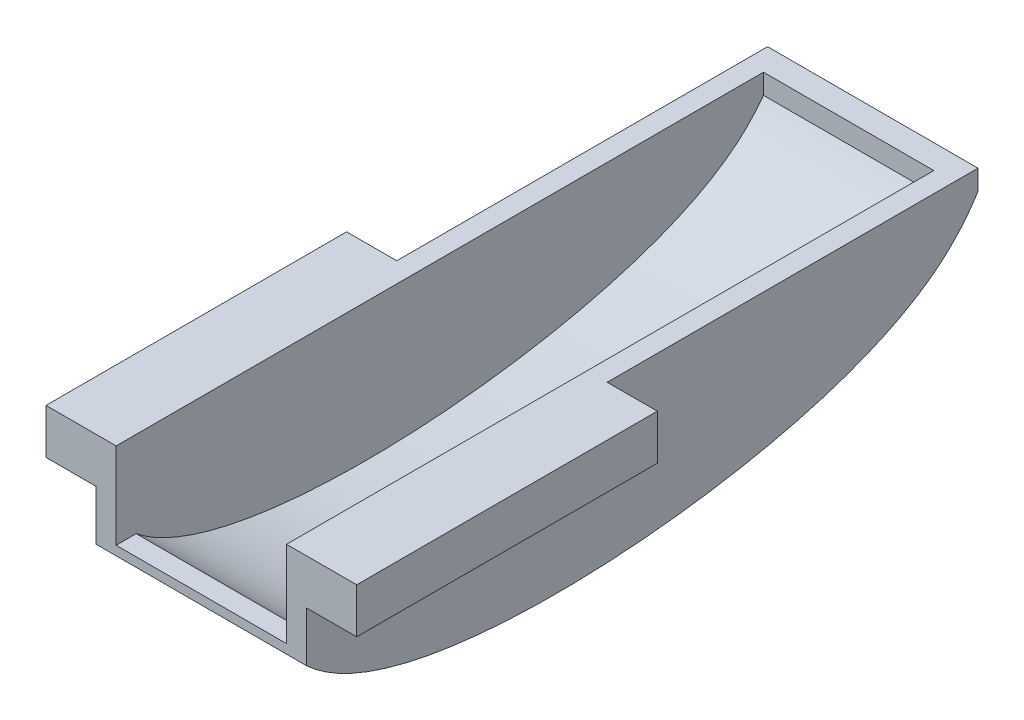
ISO-10303-21;
HEADER;
FILE_DESCRIPTION(('STEP AP214'),'2;1');
FILE_NAME('part.step','',(''),(''),'','','');
FILE_SCHEMA(('AUTOMOTIVE_DESIGN { 1 0 10303 214 1 1 1 1 }'));
ENDSEC;
DATA;
#1=APPLICATION_CONTEXT('core data for automotive mechanical design processes');
#2=APPLICATION_PROTOCOL_DEFINITION('international standard','automotive_design',2000,#1);
#3=PRODUCT_CONTEXT('',#1,'mechanical');
#4=PRODUCT('Part','Part','',(#3));
#5=PRODUCT_RELATED_PRODUCT_CATEGORY('part','',(#4));
#6=PRODUCT_DEFINITION_FORMATION('','',#4);
#7=PRODUCT_DEFINITION_CONTEXT('part definition',#1,'design');
#8=PRODUCT_DEFINITION('design','',#6,#7);
#9=PRODUCT_DEFINITION_SHAPE('','',#8);
#10=(LENGTH_UNIT() NAMED_UNIT(*) SI_UNIT(.MILLI.,.METRE.));
#11=(NAMED_UNIT(*) PLANE_ANGLE_UNIT() SI_UNIT($,.RADIAN.));
#12=(NAMED_UNIT(*) SI_UNIT($,.STERADIAN.) SOLID_ANGLE_UNIT());
#13=UNCERTAINTY_MEASURE_WITH_UNIT(LENGTH_MEASURE(1.E-05),#10,'distance_accuracy_value','');
#14=(GEOMETRIC_REPRESENTATION_CONTEXT(3) GLOBAL_UNCERTAINTY_ASSIGNED_CONTEXT((#13)) GLOBAL_UNIT_ASSIGNED_CONTEXT((#10,
#11,#12)) REPRESENTATION_CONTEXT('',''));
#15=CARTESIAN_POINT('',(0.,0.,0.));
#16=DIRECTION('',(0.,0.,1.));
#17=DIRECTION('',(1.,0.,0.));
#18=AXIS2_PLACEMENT_3D('',#15,#16,#17);
#19=CARTESIAN_POINT('',(10.5,-13.046875,30.375));
#20=DIRECTION('',(1.,0.,0.));
#21=DIRECTION('',(0.,0.,-1.));
#22=AXIS2_PLACEMENT_3D('',#19,#20,#21);
#23=PLANE('',#22);
#24=DIRECTION('',(0.,0.,1.));
#25=VECTOR('',#24,1.);
#26=CARTESIAN_POINT('',(10.5,2.00000000000028,2.40991752715528));
#27=LINE('',#26,#25);
#28=CARTESIAN_POINT('',(10.5,2.00000000000028,0.));
#29=VERTEX_POINT('',#28);
#30=CARTESIAN_POINT('',(10.5,2.00000000000028,37.));
#31=VERTEX_POINT('',#30);
#32=EDGE_CURVE('E163',#29,#31,#27,.T.);
#33=ORIENTED_EDGE('',*,*,#32,.T.);
#34=DIRECTION('',(0.,-1.,0.));
#35=VECTOR('',#34,1.);
#36=CARTESIAN_POINT('',(10.5,-2.49999999999972,37.));
#37=LINE('',#36,#35);
#38=CARTESIAN_POINT('',(10.5,-2.49999999999972,37.));
#39=VERTEX_POINT('',#38);
#40=EDGE_CURVE('E155',#31,#39,#37,.T.);
#41=ORIENTED_EDGE('',*,*,#40,.T.);
#42=DIRECTION('',(0.,0.,1.));
#43=VECTOR('',#42,1.);
#44=CARTESIAN_POINT('',(10.5,-2.49999999999972,37.));
#45=LINE('',#44,#43);
#46=CARTESIAN_POINT('',(10.5,-2.49999999999972,67.));
#47=VERTEX_POINT('',#46);
#48=EDGE_CURVE('E141',#39,#47,#45,.T.);
#49=ORIENTED_EDGE('',*,*,#48,.T.);
#50=DIRECTION('',(0.,-1.,0.));
#51=VECTOR('',#50,1.);
#52=CARTESIAN_POINT('',(10.5,-7.5,67.));
#53=LINE('',#52,#51);
#54=CARTESIAN_POINT('',(10.5,-7.5,67.));
#55=VERTEX_POINT('',#54);
#56=EDGE_CURVE('E247',#47,#55,#53,.T.);
#57=ORIENTED_EDGE('',*,*,#56,.T.);
#58=CARTESIAN_POINT('',(10.5,-7.5,67.));
#59=CARTESIAN_POINT('',(10.5,-14.,60.));
#60=CARTESIAN_POINT('',(10.5,-17.,44.));
#61=CARTESIAN_POINT('',(10.5,-13.,14.));
#62=CARTESIAN_POINT('',(10.5,-8.,5.));
#63=CARTESIAN_POINT('',(10.5,0.,0.));
#64=B_SPLINE_CURVE_WITH_KNOTS('',5,(#58,#59,#60,#61,#62,#63),.UNSPECIFIED.,.F.,.F.,(6,6),(0.,
1.),.UNSPECIFIED.);
#65=CARTESIAN_POINT('',(10.5,0.,0.));
#66=VERTEX_POINT('',#65);
#67=EDGE_CURVE('E236',#55,#66,#64,.T.);
#68=ORIENTED_EDGE('',*,*,#67,.T.);
#69=DIRECTION('',(0.,1.,0.));
#70=VECTOR('',#69,1.);
#71=CARTESIAN_POINT('',(10.5,2.00000000000028,0.));
#72=LINE('',#71,#70);
#73=EDGE_CURVE('E241',#66,#29,#72,.T.);
#74=ORIENTED_EDGE('',*,*,#73,.T.);
#75=EDGE_LOOP('',(#33,#41,#49,#57,#68,#74));
#76=FACE_BOUND('',#75,.T.);
#77=ADVANCED_FACE('F33',(#76),#23,.T.);
#78=CARTESIAN_POINT('',(-10.5,-13.046875,30.375));
#79=DIRECTION('',(1.,0.,0.));
#80=DIRECTION('',(0.,0.,-1.));
#81=AXIS2_PLACEMENT_3D('',#78,#79,#80);
#82=PLANE('',#81);
#83=DIRECTION('',(0.,0.,1.));
#84=VECTOR('',#83,1.);
#85=CARTESIAN_POINT('',(-10.5,-2.49999999999972,37.));
#86=LINE('',#85,#84);
#87=CARTESIAN_POINT('',(-10.5,-2.49999999999972,37.));
#88=VERTEX_POINT('',#87);
#89=CARTESIAN_POINT('',(-10.5,-2.49999999999972,67.));
#90=VERTEX_POINT('',#89);
#91=EDGE_CURVE('E192',#88,#90,#86,.T.);
#92=ORIENTED_EDGE('',*,*,#91,.F.);
#93=DIRECTION('',(0.,1.,0.));
#94=VECTOR('',#93,1.);
#95=CARTESIAN_POINT('',(-10.5,2.00000000000028,37.));
#96=LINE('',#95,#94);
#97=CARTESIAN_POINT('',(-10.5,2.00000000000028,37.));
#98=VERTEX_POINT('',#97);
#99=EDGE_CURVE('E177',#88,#98,#96,.T.);
#100=ORIENTED_EDGE('',*,*,#99,.T.);
#101=DIRECTION('',(0.,0.,1.));
#102=VECTOR('',#101,1.);
#103=CARTESIAN_POINT('',(-10.5,2.00000000000028,2.40991752715528));
#104=LINE('',#103,#102);
#105=CARTESIAN_POINT('',(-10.5,2.00000000000028,0.));
#106=VERTEX_POINT('',#105);
#107=EDGE_CURVE('E260',#106,#98,#104,.T.);
#108=ORIENTED_EDGE('',*,*,#107,.F.);
#109=DIRECTION('',(0.,1.,0.));
#110=VECTOR('',#109,1.);
#111=CARTESIAN_POINT('',(-10.5,2.00000000000028,0.));
#112=LINE('',#111,#110);
#113=CARTESIAN_POINT('',(-10.5,0.,0.));
#114=VERTEX_POINT('',#113);
#115=EDGE_CURVE('E254',#114,#106,#112,.T.);
#116=ORIENTED_EDGE('',*,*,#115,.F.);
#117=CARTESIAN_POINT('',(-10.5,-7.5,67.));
#118=CARTESIAN_POINT('',(-10.5,-14.,60.));
#119=CARTESIAN_POINT('',(-10.5,-17.,44.));
#120=CARTESIAN_POINT('',(-10.5,-13.,14.));
#121=CARTESIAN_POINT('',(-10.5,-8.,5.));
#122=CARTESIAN_POINT('',(-10.5,0.,0.));
#123=B_SPLINE_CURVE_WITH_KNOTS('',5,(#117,#118,#119,#120,#121,#122),.UNSPECIFIED.,.F.,.F.,(6,6),
(0.,1.),.UNSPECIFIED.);
#124=CARTESIAN_POINT('',(-10.5,-7.5,67.));
#125=VERTEX_POINT('',#124);
#126=EDGE_CURVE('E248',#125,#114,#123,.T.);
#127=ORIENTED_EDGE('',*,*,#126,.F.);
#128=DIRECTION('',(0.,-1.,0.));
#129=VECTOR('',#128,1.);
#130=CARTESIAN_POINT('',(-10.5,-7.5,67.));
#131=LINE('',#130,#129);
#132=EDGE_CURVE('E263',#90,#125,#131,.T.);
#133=ORIENTED_EDGE('',*,*,#132,.F.);
#134=EDGE_LOOP('',(#92,#100,#108,#116,#127,#133));
#135=FACE_BOUND('',#134,.T.);
#136=ADVANCED_FACE('F299',(#135),#82,.F.);
#137=CARTESIAN_POINT('',(-10.5,-6.58541733028586,65.));
#138=DIRECTION('',(0.,1.,0.));
#139=DIRECTION('',(0.,0.,1.));
#140=AXIS2_PLACEMENT_3D('',#137,#138,#139);
#141=PLANE('',#140);
#142=DIRECTION('',(1.,0.,0.));
#143=VECTOR('',#142,1.);
#144=CARTESIAN_POINT('',(-10.5,-6.58541733028586,67.));
#145=LINE('',#144,#143);
#146=CARTESIAN_POINT('',(-8.5,-6.58541733028586,67.));
#147=VERTEX_POINT('',#146);
#148=CARTESIAN_POINT('',(8.5,-6.58541733028586,67.));
#149=VERTEX_POINT('',#148);
#150=EDGE_CURVE('E43',#147,#149,#145,.T.);
#151=ORIENTED_EDGE('',*,*,#150,.T.);
#152=DIRECTION('',(0.,0.,-1.));
#153=VECTOR('',#152,1.);
#154=CARTESIAN_POINT('',(8.5,-6.58541733028586,65.));
#155=LINE('',#154,#153);
#156=CARTESIAN_POINT('',(8.49999999999999,-6.58541733028586,65.));
#157=VERTEX_POINT('',#156);
#158=EDGE_CURVE('E212',#149,#157,#155,.T.);
#159=ORIENTED_EDGE('',*,*,#158,.T.);
#160=DIRECTION('',(1.,0.,0.));
#161=VECTOR('',#160,1.);
#162=CARTESIAN_POINT('',(-10.5,-6.58541733028586,65.));
#163=LINE('',#162,#161);
#164=CARTESIAN_POINT('',(-8.5,-6.58541733028586,65.));
#165=VERTEX_POINT('',#164);
#166=EDGE_CURVE('E330',#165,#157,#163,.T.);
#167=ORIENTED_EDGE('',*,*,#166,.F.);
#168=DIRECTION('',(0.,0.,1.));
#169=VECTOR('',#168,1.);
#170=CARTESIAN_POINT('',(-8.5,-6.58541733028586,65.));
#171=LINE('',#170,#169);
#172=EDGE_CURVE('E231',#165,#147,#171,.T.);
#173=ORIENTED_EDGE('',*,*,#172,.T.);
#174=EDGE_LOOP('',(#151,#159,#167,#173));
#175=FACE_BOUND('',#174,.T.);
#176=ADVANCED_FACE('F277',(#175),#141,.T.);
#177=CARTESIAN_POINT('',(-10.5,1.05969013823158,1.69556016571188));
#178=CARTESIAN_POINT('',(-10.5,0.326468374083647,2.15382949062016));
#179=CARTESIAN_POINT('',(-10.5,-1.06829617807532,3.16044090071315));
#180=CARTESIAN_POINT('',(-10.5,-3.57411888475472,5.718312008346));
#181=CARTESIAN_POINT('',(-10.5,-6.43576100075407,10.4976857034237));
#182=CARTESIAN_POINT('',(-10.5,-9.23382079752525,19.0374388766017));
#183=CARTESIAN_POINT('',(-10.5,-11.1364315280221,29.5720475329086));
#184=CARTESIAN_POINT('',(-10.5,-11.7993859953844,38.9666765556865));
#185=CARTESIAN_POINT('',(-10.5,-11.6937557642379,46.135832890669));
#186=CARTESIAN_POINT('',(-10.5,-11.2863118300239,51.1667034980007));
#187=CARTESIAN_POINT('',(-10.5,-10.5490344311225,55.693282116091));
#188=CARTESIAN_POINT('',(-10.5,-9.67188280200554,58.9320013956317));
#189=CARTESIAN_POINT('',(-10.5,-8.82973839544355,61.1570857059076));
#190=CARTESIAN_POINT('',(-10.5,-8.13783828860439,62.6339101824341));
#191=CARTESIAN_POINT('',(-10.5,-7.38227890242257,63.9314616852654));
#192=CARTESIAN_POINT('',(-10.5,-6.86938762757851,64.6457710080204));
#193=CARTESIAN_POINT('',(-10.5,-6.58541733028586,65.));
#194=B_SPLINE_CURVE_WITH_KNOTS('',3,(#177,#178,#179,#180,#181,#182,#183,#184,#185,#186,#187,
#188,#189,#190,#191,#192,#193),.UNSPECIFIED.,.F.,.F.,(4,1,1,1,1,1,1,1,1,1,1,1,1,1,4),(0.,
0.0612295232460904,0.122459046492181,0.244918092984361,0.367377139476542,0.489836185968723,
0.612295232460904,0.673524755706994,0.734754278953084,0.795983802199175,0.857213325445265,
0.88782808706831,0.918442848691355,0.949057610314401,0.979672371937446),.UNSPECIFIED.);
#195=DIRECTION('',(1.,0.,0.));
#196=VECTOR('',#195,1.);
#197=SURFACE_OF_LINEAR_EXTRUSION('',#194,#196);
#198=ORIENTED_EDGE('',*,*,#166,.T.);
#199=CARTESIAN_POINT('',(8.49999999999999,1.05969013823158,1.69556016571188));
#200=CARTESIAN_POINT('',(8.49999999999999,0.326468374083647,2.15382949062016));
#201=CARTESIAN_POINT('',(8.49999999999999,-1.06829617807532,3.16044090071315));
#202=CARTESIAN_POINT('',(8.49999999999999,-3.57411888475472,5.718312008346));
#203=CARTESIAN_POINT('',(8.49999999999999,-6.43576100075407,10.4976857034237));
#204=CARTESIAN_POINT('',(8.49999999999999,-9.23382079752525,19.0374388766017));
#205=CARTESIAN_POINT('',(8.49999999999999,-11.1364315280221,29.5720475329086));
#206=CARTESIAN_POINT('',(8.49999999999999,-11.7993859953844,38.9666765556865));
#207=CARTESIAN_POINT('',(8.49999999999999,-11.6937557642379,46.135832890669));
#208=CARTESIAN_POINT('',(8.49999999999999,-11.2863118300239,51.1667034980007));
#209=CARTESIAN_POINT('',(8.49999999999999,-10.5490344311225,55.693282116091));
#210=CARTESIAN_POINT('',(8.49999999999999,-9.67188280200554,58.9320013956317));
#211=CARTESIAN_POINT('',(8.49999999999999,-8.82973839544355,61.1570857059076));
#212=CARTESIAN_POINT('',(8.49999999999999,-8.13783828860439,62.6339101824341));
#213=CARTESIAN_POINT('',(8.49999999999999,-7.38227890242257,63.9314616852654));
#214=CARTESIAN_POINT('',(8.49999999999999,-6.86938762757851,64.6457710080204));
#215=CARTESIAN_POINT('',(8.49999999999999,-6.58541733028586,65.));
#216=B_SPLINE_CURVE_WITH_KNOTS('',3,(#199,#200,#201,#202,#203,#204,#205,#206,#207,#208,#209,
#210,#211,#212,#213,#214,#215),.UNSPECIFIED.,.F.,.F.,(4,1,1,1,1,1,1,1,1,1,1,1,1,1,4),(0.,
0.0612295232460904,0.122459046492181,0.244918092984361,0.367377139476542,0.489836185968723,
0.612295232460904,0.673524755706994,0.734754278953084,0.795983802199175,0.857213325445265,
0.88782808706831,0.918442848691355,0.949057610314401,0.979672371937446),.UNSPECIFIED.);
#217=CARTESIAN_POINT('',(8.5,0.,2.40991752715547));
#218=VERTEX_POINT('',#217);
#219=EDGE_CURVE('E207',#157,#218,#216,.F.);
#220=ORIENTED_EDGE('',*,*,#219,.T.);
#221=DIRECTION('',(1.,0.,0.));
#222=VECTOR('',#221,1.);
#223=CARTESIAN_POINT('',(-10.5,0.,2.40991752715547));
#224=LINE('',#223,#222);
#225=CARTESIAN_POINT('',(-8.5,0.,2.40991752715547));
#226=VERTEX_POINT('',#225);
#227=EDGE_CURVE('E323',#226,#218,#224,.T.);
#228=ORIENTED_EDGE('',*,*,#227,.F.);
#229=CARTESIAN_POINT('',(-8.5,1.05969013823158,1.69556016571188));
#230=CARTESIAN_POINT('',(-8.5,0.326468374083647,2.15382949062016));
#231=CARTESIAN_POINT('',(-8.5,-1.06829617807532,3.16044090071315));
#232=CARTESIAN_POINT('',(-8.5,-3.57411888475472,5.718312008346));
#233=CARTESIAN_POINT('',(-8.5,-6.43576100075407,10.4976857034237));
#234=CARTESIAN_POINT('',(-8.5,-9.23382079752525,19.0374388766017));
#235=CARTESIAN_POINT('',(-8.5,-11.1364315280221,29.5720475329086));
#236=CARTESIAN_POINT('',(-8.5,-11.7993859953844,38.9666765556865));
#237=CARTESIAN_POINT('',(-8.5,-11.6937557642379,46.135832890669));
#238=CARTESIAN_POINT('',(-8.5,-11.2863118300239,51.1667034980007));
#239=CARTESIAN_POINT('',(-8.5,-10.5490344311225,55.693282116091));
#240=CARTESIAN_POINT('',(-8.5,-9.67188280200554,58.9320013956317));
#241=CARTESIAN_POINT('',(-8.5,-8.82973839544355,61.1570857059076));
#242=CARTESIAN_POINT('',(-8.5,-8.13783828860439,62.6339101824341));
#243=CARTESIAN_POINT('',(-8.5,-7.38227890242257,63.9314616852654));
#244=CARTESIAN_POINT('',(-8.5,-6.86938762757851,64.6457710080204));
#245=CARTESIAN_POINT('',(-8.5,-6.58541733028586,65.));
#246=B_SPLINE_CURVE_WITH_KNOTS('',3,(#229,#230,#231,#232,#233,#234,#235,#236,#237,#238,#239,
#240,#241,#242,#243,#244,#245),.UNSPECIFIED.,.F.,.F.,(4,1,1,1,1,1,1,1,1,1,1,1,1,1,4),(0.,
0.0612295232460904,0.122459046492181,0.244918092984361,0.367377139476542,0.489836185968723,
0.612295232460904,0.673524755706994,0.734754278953084,0.795983802199175,0.857213325445265,
0.88782808706831,0.918442848691355,0.949057610314401,0.979672371937446),.UNSPECIFIED.);
#247=EDGE_CURVE('E227',#226,#165,#246,.T.);
#248=ORIENTED_EDGE('',*,*,#247,.T.);
#249=EDGE_LOOP('',(#198,#220,#228,#248));
#250=FACE_BOUND('',#249,.T.);
#251=ADVANCED_FACE('F272',(#250),#197,.T.);
#252=CARTESIAN_POINT('',(-10.5,0.,2.40991752715547));
#253=DIRECTION('',(0.,0.,1.));
#254=DIRECTION('',(0.,-1.,0.));
#255=AXIS2_PLACEMENT_3D('',#252,#253,#254);
#256=PLANE('',#255);
#257=ORIENTED_EDGE('',*,*,#227,.T.);
#258=DIRECTION('',(0.,1.,0.));
#259=VECTOR('',#258,1.);
#260=CARTESIAN_POINT('',(8.5,0.,2.40991752715547));
#261=LINE('',#260,#259);
#262=CARTESIAN_POINT('',(8.5,2.00000000000028,2.40991752715528));
#263=VERTEX_POINT('',#262);
#264=EDGE_CURVE('E204',#218,#263,#261,.T.);
#265=ORIENTED_EDGE('',*,*,#264,.T.);
#266=DIRECTION('',(1.,0.,0.));
#267=VECTOR('',#266,1.);
#268=CARTESIAN_POINT('',(-10.5,2.00000000000028,2.40991752715528));
#269=LINE('',#268,#267);
#270=CARTESIAN_POINT('',(-8.5,2.00000000000028,2.40991752715528));
#271=VERTEX_POINT('',#270);
#272=EDGE_CURVE('E320',#271,#263,#269,.T.);
#273=ORIENTED_EDGE('',*,*,#272,.F.);
#274=DIRECTION('',(0.,-1.,0.));
#275=VECTOR('',#274,1.);
#276=CARTESIAN_POINT('',(-8.5,0.,2.40991752715547));
#277=LINE('',#276,#275);
#278=EDGE_CURVE('E225',#271,#226,#277,.T.);
#279=ORIENTED_EDGE('',*,*,#278,.T.);
#280=EDGE_LOOP('',(#257,#265,#273,#279));
#281=FACE_BOUND('',#280,.T.);
#282=ADVANCED_FACE('F276',(#281),#256,.T.);
#283=DIRECTION('',(1.,0.,0.));
#284=VECTOR('',#283,1.);
#285=SURFACE_OF_LINEAR_EXTRUSION('',#123,#284);
#286=ORIENTED_EDGE('',*,*,#67,.F.);
#287=DIRECTION('',(1.,0.,0.));
#288=VECTOR('',#287,1.);
#289=CARTESIAN_POINT('',(-10.5,-7.5,67.));
#290=LINE('',#289,#288);
#291=EDGE_CURVE('E11',#125,#55,#290,.T.);
#292=ORIENTED_EDGE('',*,*,#291,.F.);
#293=ORIENTED_EDGE('',*,*,#126,.T.);
#294=DIRECTION('',(1.,0.,0.));
#295=VECTOR('',#294,1.);
#296=CARTESIAN_POINT('',(-10.5,0.,0.));
#297=LINE('',#296,#295);
#298=EDGE_CURVE('E316',#114,#66,#297,.T.);
#299=ORIENTED_EDGE('',*,*,#298,.T.);
#300=EDGE_LOOP('',(#286,#292,#293,#299));
#301=FACE_BOUND('',#300,.T.);
#302=ADVANCED_FACE('F35',(#301),#285,.T.);
#303=CARTESIAN_POINT('',(-10.5,-7.5,67.));
#304=DIRECTION('',(0.,0.,1.));
#305=DIRECTION('',(1.,0.,0.));
#306=AXIS2_PLACEMENT_3D('',#303,#304,#305);
#307=PLANE('',#306);
#308=ORIENTED_EDGE('',*,*,#56,.F.);
#309=DIRECTION('',(1.,0.,0.));
#310=VECTOR('',#309,1.);
#311=CARTESIAN_POINT('',(10.5,-2.49999999999972,67.));
#312=LINE('',#311,#310);
#313=CARTESIAN_POINT('',(15.5,-2.49999999999972,67.));
#314=VERTEX_POINT('',#313);
#315=EDGE_CURVE('E50',#47,#314,#312,.T.);
#316=ORIENTED_EDGE('',*,*,#315,.T.);
#317=DIRECTION('',(0.,1.,0.));
#318=VECTOR('',#317,1.);
#319=CARTESIAN_POINT('',(15.5,-2.49999999999972,67.));
#320=LINE('',#319,#318);
#321=CARTESIAN_POINT('',(15.5,2.00000000000028,67.));
#322=VERTEX_POINT('',#321);
#323=EDGE_CURVE('E164',#314,#322,#320,.T.);
#324=ORIENTED_EDGE('',*,*,#323,.T.);
#325=DIRECTION('',(1.,0.,0.));
#326=VECTOR('',#325,1.);
#327=CARTESIAN_POINT('',(8.5,2.00000000000028,67.));
#328=LINE('',#327,#326);
#329=CARTESIAN_POINT('',(8.5,2.00000000000028,67.));
#330=VERTEX_POINT('',#329);
#331=EDGE_CURVE('E202',#330,#322,#328,.T.);
#332=ORIENTED_EDGE('',*,*,#331,.F.);
#333=DIRECTION('',(0.,1.,0.));
#334=VECTOR('',#333,1.);
#335=CARTESIAN_POINT('',(8.5,-7.5,67.));
#336=LINE('',#335,#334);
#337=EDGE_CURVE('E200',#149,#330,#336,.T.);
#338=ORIENTED_EDGE('',*,*,#337,.F.);
#339=ORIENTED_EDGE('',*,*,#150,.F.);
#340=DIRECTION('',(0.,1.,0.));
#341=VECTOR('',#340,1.);
#342=CARTESIAN_POINT('',(-8.5,-7.5,67.));
#343=LINE('',#342,#341);
#344=CARTESIAN_POINT('',(-8.5,2.00000000000028,67.));
#345=VERTEX_POINT('',#344);
#346=EDGE_CURVE('E218',#147,#345,#343,.T.);
#347=ORIENTED_EDGE('',*,*,#346,.T.);
#348=DIRECTION('',(-1.,0.,0.));
#349=VECTOR('',#348,1.);
#350=CARTESIAN_POINT('',(-8.5,2.00000000000028,67.));
#351=LINE('',#350,#349);
#352=CARTESIAN_POINT('',(-15.5,2.00000000000028,67.));
#353=VERTEX_POINT('',#352);
#354=EDGE_CURVE('E223',#345,#353,#351,.T.);
#355=ORIENTED_EDGE('',*,*,#354,.T.);
#356=DIRECTION('',(0.,-1.,0.));
#357=VECTOR('',#356,1.);
#358=CARTESIAN_POINT('',(-15.5,2.00000000000028,67.));
#359=LINE('',#358,#357);
#360=CARTESIAN_POINT('',(-15.5,-2.49999999999972,67.));
#361=VERTEX_POINT('',#360);
#362=EDGE_CURVE('E175',#353,#361,#359,.T.);
#363=ORIENTED_EDGE('',*,*,#362,.T.);
#364=DIRECTION('',(1.,0.,0.));
#365=VECTOR('',#364,1.);
#366=CARTESIAN_POINT('',(-10.5,-2.49999999999972,67.));
#367=LINE('',#366,#365);
#368=EDGE_CURVE('E179',#361,#90,#367,.T.);
#369=ORIENTED_EDGE('',*,*,#368,.T.);
#370=ORIENTED_EDGE('',*,*,#132,.T.);
#371=ORIENTED_EDGE('',*,*,#291,.T.);
#372=EDGE_LOOP('',(#308,#316,#324,#332,#338,#339,#347,#355,#363,#369,#370,#371));
#373=FACE_BOUND('',#372,.T.);
#374=ADVANCED_FACE('F286',(#373),#307,.T.);
#375=CARTESIAN_POINT('',(-10.5,2.00000000000028,2.40991752715528));
#376=DIRECTION('',(0.,1.,0.));
#377=DIRECTION('',(0.,0.,1.));
#378=AXIS2_PLACEMENT_3D('',#375,#376,#377);
#379=PLANE('',#378);
#380=ORIENTED_EDGE('',*,*,#32,.F.);
#381=DIRECTION('',(1.,0.,0.));
#382=VECTOR('',#381,1.);
#383=CARTESIAN_POINT('',(-10.5,2.00000000000028,0.));
#384=LINE('',#383,#382);
#385=EDGE_CURVE('E318',#106,#29,#384,.T.);
#386=ORIENTED_EDGE('',*,*,#385,.F.);
#387=ORIENTED_EDGE('',*,*,#107,.T.);
#388=DIRECTION('',(-1.,0.,0.));
#389=VECTOR('',#388,1.);
#390=CARTESIAN_POINT('',(-10.5,2.00000000000028,37.));
#391=LINE('',#390,#389);
#392=CARTESIAN_POINT('',(-15.5,2.00000000000028,37.));
#393=VERTEX_POINT('',#392);
#394=EDGE_CURVE('E58',#98,#393,#391,.T.);
#395=ORIENTED_EDGE('',*,*,#394,.T.);
#396=DIRECTION('',(0.,0.,1.));
#397=VECTOR('',#396,1.);
#398=CARTESIAN_POINT('',(-15.5,2.00000000000028,37.));
#399=LINE('',#398,#397);
#400=EDGE_CURVE('E187',#393,#353,#399,.T.);
#401=ORIENTED_EDGE('',*,*,#400,.T.);
#402=ORIENTED_EDGE('',*,*,#354,.F.);
#403=DIRECTION('',(0.,0.,-1.));
#404=VECTOR('',#403,1.);
#405=CARTESIAN_POINT('',(-8.5,2.00000000000028,0.));
#406=LINE('',#405,#404);
#407=EDGE_CURVE('E220',#345,#271,#406,.T.);
#408=ORIENTED_EDGE('',*,*,#407,.T.);
#409=ORIENTED_EDGE('',*,*,#272,.T.);
#410=DIRECTION('',(0.,0.,-1.));
#411=VECTOR('',#410,1.);
#412=CARTESIAN_POINT('',(8.5,2.00000000000028,0.));
#413=LINE('',#412,#411);
#414=EDGE_CURVE('E194',#330,#263,#413,.T.);
#415=ORIENTED_EDGE('',*,*,#414,.F.);
#416=ORIENTED_EDGE('',*,*,#331,.T.);
#417=DIRECTION('',(0.,0.,1.));
#418=VECTOR('',#417,1.);
#419=CARTESIAN_POINT('',(15.5,2.00000000000028,37.));
#420=LINE('',#419,#418);
#421=CARTESIAN_POINT('',(15.5,2.00000000000028,37.));
#422=VERTEX_POINT('',#421);
#423=EDGE_CURVE('E172',#422,#322,#420,.T.);
#424=ORIENTED_EDGE('',*,*,#423,.F.);
#425=DIRECTION('',(-1.,0.,0.));
#426=VECTOR('',#425,1.);
#427=CARTESIAN_POINT('',(10.5,2.00000000000028,37.));
#428=LINE('',#427,#426);
#429=EDGE_CURVE('E149',#422,#31,#428,.T.);
#430=ORIENTED_EDGE('',*,*,#429,.T.);
#431=EDGE_LOOP('',(#380,#386,#387,#395,#401,#402,#408,#409,#415,#416,#424,#430));
#432=FACE_BOUND('',#431,.T.);
#433=ADVANCED_FACE('F283',(#432),#379,.T.);
#434=CARTESIAN_POINT('',(-10.5,2.00000000000028,0.));
#435=DIRECTION('',(0.,0.,-1.));
#436=DIRECTION('',(-1.,0.,0.));
#437=AXIS2_PLACEMENT_3D('',#434,#435,#436);
#438=PLANE('',#437);
#439=ORIENTED_EDGE('',*,*,#73,.F.);
#440=ORIENTED_EDGE('',*,*,#298,.F.);
#441=ORIENTED_EDGE('',*,*,#115,.T.);
#442=ORIENTED_EDGE('',*,*,#385,.T.);
#443=EDGE_LOOP('',(#439,#440,#441,#442));
#444=FACE_BOUND('',#443,.T.);
#445=ADVANCED_FACE('F285',(#444),#438,.T.);
#446=CARTESIAN_POINT('',(-8.5,-13.046875,30.375));
#447=DIRECTION('',(-1.,0.,0.));
#448=DIRECTION('',(0.,0.,1.));
#449=AXIS2_PLACEMENT_3D('',#446,#447,#448);
#450=PLANE('',#449);
#451=ORIENTED_EDGE('',*,*,#172,.F.);
#452=ORIENTED_EDGE('',*,*,#247,.F.);
#453=ORIENTED_EDGE('',*,*,#278,.F.);
#454=ORIENTED_EDGE('',*,*,#407,.F.);
#455=ORIENTED_EDGE('',*,*,#346,.F.);
#456=EDGE_LOOP('',(#451,#452,#453,#454,#455));
#457=FACE_BOUND('',#456,.T.);
#458=ADVANCED_FACE('F289',(#457),#450,.F.);
#459=CARTESIAN_POINT('',(8.5,-13.046875,30.375));
#460=DIRECTION('',(1.,0.,0.));
#461=DIRECTION('',(0.,0.,1.));
#462=AXIS2_PLACEMENT_3D('',#459,#460,#461);
#463=PLANE('',#462);
#464=ORIENTED_EDGE('',*,*,#158,.F.);
#465=ORIENTED_EDGE('',*,*,#337,.T.);
#466=ORIENTED_EDGE('',*,*,#414,.T.);
#467=ORIENTED_EDGE('',*,*,#264,.F.);
#468=ORIENTED_EDGE('',*,*,#219,.F.);
#469=EDGE_LOOP('',(#464,#465,#466,#467,#468));
#470=FACE_BOUND('',#469,.T.);
#471=ADVANCED_FACE('F294',(#470),#463,.F.);
#472=CARTESIAN_POINT('',(-10.5,-2.49999999999972,37.));
#473=DIRECTION('',(0.,-1.,0.));
#474=DIRECTION('',(1.,0.,0.));
#475=AXIS2_PLACEMENT_3D('',#472,#473,#474);
#476=PLANE('',#475);
#477=ORIENTED_EDGE('',*,*,#368,.F.);
#478=DIRECTION('',(0.,0.,1.));
#479=VECTOR('',#478,1.);
#480=CARTESIAN_POINT('',(-15.5,-2.49999999999972,37.));
#481=LINE('',#480,#479);
#482=CARTESIAN_POINT('',(-15.5,-2.49999999999972,37.));
#483=VERTEX_POINT('',#482);
#484=EDGE_CURVE('E195',#483,#361,#481,.T.);
#485=ORIENTED_EDGE('',*,*,#484,.F.);
#486=DIRECTION('',(1.,0.,0.));
#487=VECTOR('',#486,1.);
#488=CARTESIAN_POINT('',(-10.5,-2.49999999999972,37.));
#489=LINE('',#488,#487);
#490=EDGE_CURVE('E184',#483,#88,#489,.T.);
#491=ORIENTED_EDGE('',*,*,#490,.T.);
#492=ORIENTED_EDGE('',*,*,#91,.T.);
#493=EDGE_LOOP('',(#477,#485,#491,#492));
#494=FACE_BOUND('',#493,.T.);
#495=ADVANCED_FACE('F352',(#494),#476,.T.);
#496=CARTESIAN_POINT('',(-15.5,2.00000000000028,37.));
#497=DIRECTION('',(-1.,0.,0.));
#498=DIRECTION('',(0.,0.,1.));
#499=AXIS2_PLACEMENT_3D('',#496,#497,#498);
#500=PLANE('',#499);
#501=ORIENTED_EDGE('',*,*,#362,.F.);
#502=ORIENTED_EDGE('',*,*,#400,.F.);
#503=DIRECTION('',(0.,-1.,0.));
#504=VECTOR('',#503,1.);
#505=CARTESIAN_POINT('',(-15.5,2.00000000000028,37.));
#506=LINE('',#505,#504);
#507=EDGE_CURVE('E181',#393,#483,#506,.T.);
#508=ORIENTED_EDGE('',*,*,#507,.T.);
#509=ORIENTED_EDGE('',*,*,#484,.T.);
#510=EDGE_LOOP('',(#501,#502,#508,#509));
#511=FACE_BOUND('',#510,.T.);
#512=ADVANCED_FACE('F356',(#511),#500,.T.);
#513=CARTESIAN_POINT('',(0.,0.,37.));
#514=DIRECTION('',(0.,0.,-1.));
#515=DIRECTION('',(-1.,0.,0.));
#516=AXIS2_PLACEMENT_3D('',#513,#514,#515);
#517=PLANE('',#516);
#518=ORIENTED_EDGE('',*,*,#99,.F.);
#519=ORIENTED_EDGE('',*,*,#490,.F.);
#520=ORIENTED_EDGE('',*,*,#507,.F.);
#521=ORIENTED_EDGE('',*,*,#394,.F.);
#522=EDGE_LOOP('',(#518,#519,#520,#521));
#523=FACE_BOUND('',#522,.T.);
#524=ADVANCED_FACE('F355',(#523),#517,.T.);
#525=CARTESIAN_POINT('',(15.5,-2.49999999999972,37.));
#526=DIRECTION('',(1.,0.,0.));
#527=DIRECTION('',(0.,0.,-1.));
#528=AXIS2_PLACEMENT_3D('',#525,#526,#527);
#529=PLANE('',#528);
#530=ORIENTED_EDGE('',*,*,#323,.F.);
#531=DIRECTION('',(0.,0.,1.));
#532=VECTOR('',#531,1.);
#533=CARTESIAN_POINT('',(15.5,-2.49999999999972,37.));
#534=LINE('',#533,#532);
#535=CARTESIAN_POINT('',(15.5,-2.49999999999972,37.));
#536=VERTEX_POINT('',#535);
#537=EDGE_CURVE('E148',#536,#314,#534,.T.);
#538=ORIENTED_EDGE('',*,*,#537,.F.);
#539=DIRECTION('',(0.,1.,0.));
#540=VECTOR('',#539,1.);
#541=CARTESIAN_POINT('',(15.5,-2.49999999999972,37.));
#542=LINE('',#541,#540);
#543=EDGE_CURVE('E158',#536,#422,#542,.T.);
#544=ORIENTED_EDGE('',*,*,#543,.T.);
#545=ORIENTED_EDGE('',*,*,#423,.T.);
#546=EDGE_LOOP('',(#530,#538,#544,#545));
#547=FACE_BOUND('',#546,.T.);
#548=ADVANCED_FACE('F363',(#547),#529,.T.);
#549=CARTESIAN_POINT('',(10.5,-2.49999999999972,37.));
#550=DIRECTION('',(0.,-1.,0.));
#551=DIRECTION('',(0.,0.,-1.));
#552=AXIS2_PLACEMENT_3D('',#549,#550,#551);
#553=PLANE('',#552);
#554=ORIENTED_EDGE('',*,*,#315,.F.);
#555=ORIENTED_EDGE('',*,*,#48,.F.);
#556=DIRECTION('',(1.,0.,0.));
#557=VECTOR('',#556,1.);
#558=CARTESIAN_POINT('',(10.5,-2.49999999999972,37.));
#559=LINE('',#558,#557);
#560=EDGE_CURVE('E144',#39,#536,#559,.T.);
#561=ORIENTED_EDGE('',*,*,#560,.T.);
#562=ORIENTED_EDGE('',*,*,#537,.T.);
#563=EDGE_LOOP('',(#554,#555,#561,#562));
#564=FACE_BOUND('',#563,.T.);
#565=ADVANCED_FACE('F143',(#564),#553,.T.);
#566=CARTESIAN_POINT('',(0.,0.,37.));
#567=DIRECTION('',(0.,0.,-1.));
#568=DIRECTION('',(-1.,0.,0.));
#569=AXIS2_PLACEMENT_3D('',#566,#567,#568);
#570=PLANE('',#569);
#571=ORIENTED_EDGE('',*,*,#40,.F.);
#572=ORIENTED_EDGE('',*,*,#429,.F.);
#573=ORIENTED_EDGE('',*,*,#543,.F.);
#574=ORIENTED_EDGE('',*,*,#560,.F.);
#575=EDGE_LOOP('',(#571,#572,#573,#574));
#576=FACE_BOUND('',#575,.T.);
#577=ADVANCED_FACE('F153',(#576),#570,.T.);
#578=CLOSED_SHELL('',(#77,#136,#176,#251,#282,#302,#374,#433,#445,#458,#471,#495,#512,#524,#548,
#565,#577));
#579=MANIFOLD_SOLID_BREP('B2',#578);
#580=ADVANCED_BREP_SHAPE_REPRESENTATION('',(#18,#579),#14);
#581=SHAPE_DEFINITION_REPRESENTATION(#9,#580);
ENDSEC;
END-ISO-10303-21;
